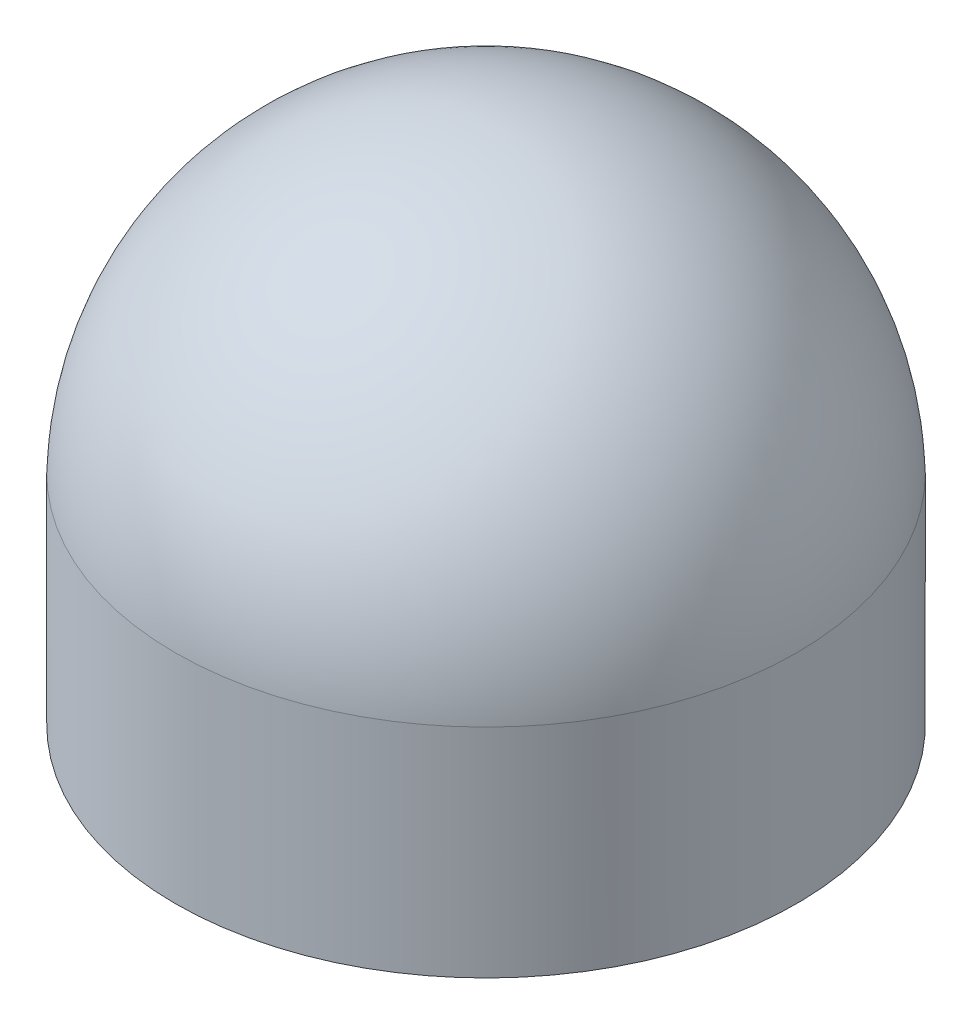
ISO-10303-21;
HEADER;
FILE_DESCRIPTION(('STEP AP214'),'2;1');
FILE_NAME('part.step','',(''),(''),'','','');
FILE_SCHEMA(('AUTOMOTIVE_DESIGN { 1 0 10303 214 1 1 1 1 }'));
ENDSEC;
DATA;
#1=APPLICATION_CONTEXT('core data for automotive mechanical design processes');
#2=APPLICATION_PROTOCOL_DEFINITION('international standard','automotive_design',2000,#1);
#3=PRODUCT_CONTEXT('',#1,'mechanical');
#4=PRODUCT('Part','Part','',(#3));
#5=PRODUCT_RELATED_PRODUCT_CATEGORY('part','',(#4));
#6=PRODUCT_DEFINITION_FORMATION('','',#4);
#7=PRODUCT_DEFINITION_CONTEXT('part definition',#1,'design');
#8=PRODUCT_DEFINITION('design','',#6,#7);
#9=PRODUCT_DEFINITION_SHAPE('','',#8);
#10=(LENGTH_UNIT() NAMED_UNIT(*) SI_UNIT(.MILLI.,.METRE.));
#11=(NAMED_UNIT(*) PLANE_ANGLE_UNIT() SI_UNIT($,.RADIAN.));
#12=(NAMED_UNIT(*) SI_UNIT($,.STERADIAN.) SOLID_ANGLE_UNIT());
#13=UNCERTAINTY_MEASURE_WITH_UNIT(LENGTH_MEASURE(1.E-05),#10,'distance_accuracy_value','');
#14=(GEOMETRIC_REPRESENTATION_CONTEXT(3) GLOBAL_UNCERTAINTY_ASSIGNED_CONTEXT((#13)) GLOBAL_UNIT_ASSIGNED_CONTEXT((#10,
#11,#12)) REPRESENTATION_CONTEXT('',''));
#15=CARTESIAN_POINT('',(0.,0.,0.));
#16=DIRECTION('',(0.,0.,1.));
#17=DIRECTION('',(1.,0.,0.));
#18=AXIS2_PLACEMENT_3D('',#15,#16,#17);
#19=CARTESIAN_POINT('',(0.,0.,-2.6));
#20=DIRECTION('',(0.,1.,0.));
#21=DIRECTION('',(0.,0.,1.));
#22=AXIS2_PLACEMENT_3D('',#19,#20,#21);
#23=PLANE('',#22);
#24=CARTESIAN_POINT('',(0.,0.,0.));
#25=DIRECTION('',(0.,1.,0.));
#26=DIRECTION('',(0.,0.,1.));
#27=AXIS2_PLACEMENT_3D('',#24,#25,#26);
#28=CIRCLE('',#27,3.6);
#29=CARTESIAN_POINT('',(0.,0.,3.60000000000001));
#30=VERTEX_POINT('',#29);
#31=EDGE_CURVE('E54',#30,#30,#28,.T.);
#32=ORIENTED_EDGE('',*,*,#31,.F.);
#33=EDGE_LOOP('',(#32));
#34=FACE_BOUND('',#33,.T.);
#35=CARTESIAN_POINT('',(0.,0.,0.));
#36=DIRECTION('',(0.,1.,0.));
#37=DIRECTION('',(0.,0.,1.));
#38=AXIS2_PLACEMENT_3D('',#35,#36,#37);
#39=CIRCLE('',#38,2.6);
#40=CARTESIAN_POINT('',(0.,0.,2.60000000000001));
#41=VERTEX_POINT('',#40);
#42=EDGE_CURVE('E10',#41,#41,#39,.T.);
#43=ORIENTED_EDGE('',*,*,#42,.T.);
#44=EDGE_LOOP('',(#43));
#45=FACE_BOUND('',#44,.T.);
#46=ADVANCED_FACE('F37',(#34,#45),#23,.F.);
#47=CARTESIAN_POINT('',(0.,6.,0.));
#48=DIRECTION('',(0.,1.,0.));
#49=DIRECTION('',(0.,0.,1.));
#50=AXIS2_PLACEMENT_3D('',#47,#48,#49);
#51=CYLINDRICAL_SURFACE('',#50,2.6);
#52=ORIENTED_EDGE('',*,*,#42,.F.);
#53=EDGE_LOOP('',(#52));
#54=FACE_BOUND('',#53,.T.);
#55=CARTESIAN_POINT('',(0.,2.5,0.));
#56=DIRECTION('',(0.,1.,0.));
#57=DIRECTION('',(0.,0.,1.));
#58=AXIS2_PLACEMENT_3D('',#55,#56,#57);
#59=CIRCLE('',#58,2.6);
#60=CARTESIAN_POINT('',(0.,2.50000000000001,2.6));
#61=VERTEX_POINT('',#60);
#62=EDGE_CURVE('E44',#61,#61,#59,.T.);
#63=ORIENTED_EDGE('',*,*,#62,.T.);
#64=EDGE_LOOP('',(#63));
#65=FACE_BOUND('',#64,.T.);
#66=ADVANCED_FACE('F64',(#54,#65),#51,.F.);
#67=CARTESIAN_POINT('',(0.,2.398,0.));
#68=DIRECTION('',(0.,1.,0.));
#69=DIRECTION('',(0.,0.,1.));
#70=AXIS2_PLACEMENT_3D('',#67,#68,#69);
#71=SPHERICAL_SURFACE('',#70,2.602);
#72=ORIENTED_EDGE('',*,*,#62,.F.);
#73=EDGE_LOOP('',(#72));
#74=FACE_BOUND('',#73,.T.);
#75=ADVANCED_FACE('F68',(#74),#71,.F.);
#76=CARTESIAN_POINT('',(0.,2.398,0.));
#77=DIRECTION('',(0.,1.,0.));
#78=DIRECTION('',(0.,0.,-1.));
#79=AXIS2_PLACEMENT_3D('',#76,#77,#78);
#80=SPHERICAL_SURFACE('',#79,3.602);
#81=CARTESIAN_POINT('',(0.,2.51801666550942,0.));
#82=DIRECTION('',(0.,1.,0.));
#83=DIRECTION('',(0.,0.,1.));
#84=AXIS2_PLACEMENT_3D('',#81,#82,#83);
#85=CIRCLE('',#84,3.6);
#86=CARTESIAN_POINT('',(0.,2.51801666550942,3.6));
#87=VERTEX_POINT('',#86);
#88=EDGE_CURVE('E49',#87,#87,#85,.T.);
#89=ORIENTED_EDGE('',*,*,#88,.T.);
#90=EDGE_LOOP('',(#89));
#91=FACE_BOUND('',#90,.T.);
#92=ADVANCED_FACE('F73',(#91),#80,.T.);
#93=CARTESIAN_POINT('',(0.,6.,0.));
#94=DIRECTION('',(0.,1.,0.));
#95=DIRECTION('',(0.,0.,1.));
#96=AXIS2_PLACEMENT_3D('',#93,#94,#95);
#97=CYLINDRICAL_SURFACE('',#96,3.6);
#98=ORIENTED_EDGE('',*,*,#88,.F.);
#99=EDGE_LOOP('',(#98));
#100=FACE_BOUND('',#99,.T.);
#101=ORIENTED_EDGE('',*,*,#31,.T.);
#102=EDGE_LOOP('',(#101));
#103=FACE_BOUND('',#102,.T.);
#104=ADVANCED_FACE('F61',(#100,#103),#97,.T.);
#105=CLOSED_SHELL('',(#46,#66,#75,#92,#104));
#106=MANIFOLD_SOLID_BREP('B2',#105);
#107=ADVANCED_BREP_SHAPE_REPRESENTATION('',(#18,#106),#14);
#108=SHAPE_DEFINITION_REPRESENTATION(#9,#107);
ENDSEC;
END-ISO-10303-21;
